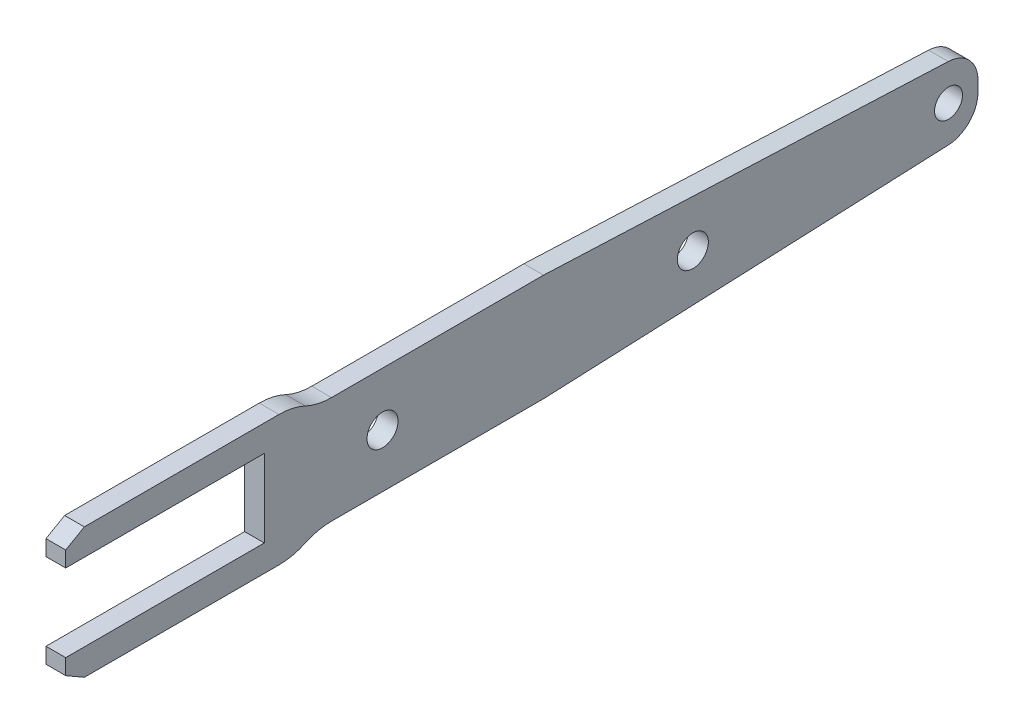
ISO-10303-21;
HEADER;
FILE_DESCRIPTION(('STEP AP214'),'2;1');
FILE_NAME('part.step','',(''),(''),'','','');
FILE_SCHEMA(('AUTOMOTIVE_DESIGN { 1 0 10303 214 1 1 1 1 }'));
ENDSEC;
DATA;
#1=APPLICATION_CONTEXT('core data for automotive mechanical design processes');
#2=APPLICATION_PROTOCOL_DEFINITION('international standard','automotive_design',2000,#1);
#3=PRODUCT_CONTEXT('',#1,'mechanical');
#4=PRODUCT('Part','Part','',(#3));
#5=PRODUCT_RELATED_PRODUCT_CATEGORY('part','',(#4));
#6=PRODUCT_DEFINITION_FORMATION('','',#4);
#7=PRODUCT_DEFINITION_CONTEXT('part definition',#1,'design');
#8=PRODUCT_DEFINITION('design','',#6,#7);
#9=PRODUCT_DEFINITION_SHAPE('','',#8);
#10=(LENGTH_UNIT() NAMED_UNIT(*) SI_UNIT(.MILLI.,.METRE.));
#11=(NAMED_UNIT(*) PLANE_ANGLE_UNIT() SI_UNIT($,.RADIAN.));
#12=(NAMED_UNIT(*) SI_UNIT($,.STERADIAN.) SOLID_ANGLE_UNIT());
#13=UNCERTAINTY_MEASURE_WITH_UNIT(LENGTH_MEASURE(1.E-05),#10,'distance_accuracy_value','');
#14=(GEOMETRIC_REPRESENTATION_CONTEXT(3) GLOBAL_UNCERTAINTY_ASSIGNED_CONTEXT((#13)) GLOBAL_UNIT_ASSIGNED_CONTEXT((#10,
#11,#12)) REPRESENTATION_CONTEXT('',''));
#15=CARTESIAN_POINT('',(0.,0.,0.));
#16=DIRECTION('',(0.,0.,1.));
#17=DIRECTION('',(1.,0.,0.));
#18=AXIS2_PLACEMENT_3D('',#15,#16,#17);
#19=CARTESIAN_POINT('',(-6.57499999999999,-6.25,-32.));
#20=DIRECTION('',(0.,-1.,0.));
#21=DIRECTION('',(0.,0.,-1.));
#22=AXIS2_PLACEMENT_3D('',#19,#20,#21);
#23=PLANE('',#22);
#24=DIRECTION('',(0.,0.,1.));
#25=VECTOR('',#24,1.);
#26=CARTESIAN_POINT('',(-9.74999999999999,-6.25,-32.));
#27=LINE('',#26,#25);
#28=CARTESIAN_POINT('',(-9.74999999999999,-6.25,-32.));
#29=VERTEX_POINT('',#28);
#30=CARTESIAN_POINT('',(-9.74999999999999,-6.25,0.));
#31=VERTEX_POINT('',#30);
#32=EDGE_CURVE('E203',#29,#31,#27,.T.);
#33=ORIENTED_EDGE('',*,*,#32,.T.);
#34=DIRECTION('',(-1.,0.,0.));
#35=VECTOR('',#34,1.);
#36=CARTESIAN_POINT('',(-6.57499999999999,-6.25,0.));
#37=LINE('',#36,#35);
#38=CARTESIAN_POINT('',(-6.57499999999999,-6.25,0.));
#39=VERTEX_POINT('',#38);
#40=EDGE_CURVE('E185',#39,#31,#37,.T.);
#41=ORIENTED_EDGE('',*,*,#40,.F.);
#42=DIRECTION('',(0.,0.,1.));
#43=VECTOR('',#42,1.);
#44=CARTESIAN_POINT('',(-6.57499999999999,-6.25,-32.));
#45=LINE('',#44,#43);
#46=CARTESIAN_POINT('',(-6.57499999999999,-6.25,-32.));
#47=VERTEX_POINT('',#46);
#48=EDGE_CURVE('E191',#47,#39,#45,.T.);
#49=ORIENTED_EDGE('',*,*,#48,.F.);
#50=DIRECTION('',(-1.,0.,0.));
#51=VECTOR('',#50,1.);
#52=CARTESIAN_POINT('',(-6.57499999999999,-6.25,-32.));
#53=LINE('',#52,#51);
#54=EDGE_CURVE('E282',#47,#29,#53,.T.);
#55=ORIENTED_EDGE('',*,*,#54,.T.);
#56=EDGE_LOOP('',(#33,#41,#49,#55));
#57=FACE_BOUND('',#56,.T.);
#58=ADVANCED_FACE('F41',(#57),#23,.F.);
#59=CARTESIAN_POINT('',(-6.57499999999999,-6.25,0.));
#60=DIRECTION('',(0.,0.,-1.));
#61=DIRECTION('',(-1.,0.,0.));
#62=AXIS2_PLACEMENT_3D('',#59,#60,#61);
#63=PLANE('',#62);
#64=DIRECTION('',(0.,-1.,0.));
#65=VECTOR('',#64,1.);
#66=CARTESIAN_POINT('',(-9.74999999999999,-6.25,0.));
#67=LINE('',#66,#65);
#68=CARTESIAN_POINT('',(-9.74999999999999,-8.76794919243112,0.));
#69=VERTEX_POINT('',#68);
#70=EDGE_CURVE('E284',#31,#69,#67,.T.);
#71=ORIENTED_EDGE('',*,*,#70,.T.);
#72=DIRECTION('',(-1.,0.,0.));
#73=VECTOR('',#72,1.);
#74=CARTESIAN_POINT('',(-6.57499999999999,-8.76794919243112,0.));
#75=LINE('',#74,#73);
#76=CARTESIAN_POINT('',(-6.57499999999999,-8.76794919243112,0.));
#77=VERTEX_POINT('',#76);
#78=EDGE_CURVE('E188',#77,#69,#75,.T.);
#79=ORIENTED_EDGE('',*,*,#78,.F.);
#80=DIRECTION('',(0.,-1.,0.));
#81=VECTOR('',#80,1.);
#82=CARTESIAN_POINT('',(-6.57499999999999,-6.25,0.));
#83=LINE('',#82,#81);
#84=EDGE_CURVE('E181',#39,#77,#83,.T.);
#85=ORIENTED_EDGE('',*,*,#84,.F.);
#86=ORIENTED_EDGE('',*,*,#40,.T.);
#87=EDGE_LOOP('',(#71,#79,#85,#86));
#88=FACE_BOUND('',#87,.T.);
#89=ADVANCED_FACE('F183',(#88),#63,.F.);
#90=CARTESIAN_POINT('',(-6.57499999999999,-8.76794919243112,0.));
#91=DIRECTION('',(0.,0.86602540378444,-0.499999999999997));
#92=DIRECTION('',(0.,0.499999999999998,0.86602540378444));
#93=AXIS2_PLACEMENT_3D('',#90,#91,#92);
#94=PLANE('',#93);
#95=DIRECTION('',(0.,-0.499999999999997,-0.86602540378444));
#96=VECTOR('',#95,1.);
#97=CARTESIAN_POINT('',(-9.74999999999999,-8.76794919243112,0.));
#98=LINE('',#97,#96);
#99=CARTESIAN_POINT('',(-9.74999999999999,-10.5,-3.00000000000002));
#100=VERTEX_POINT('',#99);
#101=EDGE_CURVE('E286',#69,#100,#98,.T.);
#102=ORIENTED_EDGE('',*,*,#101,.T.);
#103=DIRECTION('',(-1.,0.,0.));
#104=VECTOR('',#103,1.);
#105=CARTESIAN_POINT('',(-6.57499999999999,-10.5,-3.00000000000002));
#106=LINE('',#105,#104);
#107=CARTESIAN_POINT('',(-6.57499999999999,-10.5,-3.00000000000002));
#108=VERTEX_POINT('',#107);
#109=EDGE_CURVE('E209',#108,#100,#106,.T.);
#110=ORIENTED_EDGE('',*,*,#109,.F.);
#111=DIRECTION('',(0.,-0.499999999999997,-0.86602540378444));
#112=VECTOR('',#111,1.);
#113=CARTESIAN_POINT('',(-6.57499999999999,-8.76794919243112,0.));
#114=LINE('',#113,#112);
#115=EDGE_CURVE('E190',#77,#108,#114,.T.);
#116=ORIENTED_EDGE('',*,*,#115,.F.);
#117=ORIENTED_EDGE('',*,*,#78,.T.);
#118=EDGE_LOOP('',(#102,#110,#116,#117));
#119=FACE_BOUND('',#118,.T.);
#120=ADVANCED_FACE('F369',(#119),#94,.F.);
#121=CARTESIAN_POINT('',(-6.57499999999999,-10.5,-3.00000000000002));
#122=DIRECTION('',(0.,1.,0.));
#123=DIRECTION('',(0.,0.,1.));
#124=AXIS2_PLACEMENT_3D('',#121,#122,#123);
#125=PLANE('',#124);
#126=DIRECTION('',(0.,0.,-1.));
#127=VECTOR('',#126,1.);
#128=CARTESIAN_POINT('',(-9.74999999999999,-10.5,-3.00000000000002));
#129=LINE('',#128,#127);
#130=CARTESIAN_POINT('',(-9.74999999999999,-10.5,-34.3747686216376));
#131=VERTEX_POINT('',#130);
#132=EDGE_CURVE('E288',#100,#131,#129,.T.);
#133=ORIENTED_EDGE('',*,*,#132,.T.);
#134=DIRECTION('',(-1.,0.,0.));
#135=VECTOR('',#134,1.);
#136=CARTESIAN_POINT('',(-6.57499999999999,-10.5,-34.3747686216376));
#137=LINE('',#136,#135);
#138=CARTESIAN_POINT('',(-6.57499999999999,-10.5,-34.3747686216376));
#139=VERTEX_POINT('',#138);
#140=EDGE_CURVE('E343',#139,#131,#137,.T.);
#141=ORIENTED_EDGE('',*,*,#140,.F.);
#142=DIRECTION('',(0.,0.,-1.));
#143=VECTOR('',#142,1.);
#144=CARTESIAN_POINT('',(-6.57499999999999,-10.5,-3.00000000000002));
#145=LINE('',#144,#143);
#146=EDGE_CURVE('E256',#108,#139,#145,.T.);
#147=ORIENTED_EDGE('',*,*,#146,.F.);
#148=ORIENTED_EDGE('',*,*,#109,.T.);
#149=EDGE_LOOP('',(#133,#141,#147,#148));
#150=FACE_BOUND('',#149,.T.);
#151=ADVANCED_FACE('F350',(#150),#125,.F.);
#152=CARTESIAN_POINT('',(-6.57499999999999,-0.5,-34.3747686216376));
#153=DIRECTION('',(-1.,0.,0.));
#154=DIRECTION('',(0.,0.,1.));
#155=AXIS2_PLACEMENT_3D('',#152,#153,#154);
#156=CYLINDRICAL_SURFACE('',#155,9.99999999999999);
#157=CARTESIAN_POINT('',(-9.74999999999999,-0.5,-34.3747686216376));
#158=DIRECTION('',(1.,0.,0.));
#159=DIRECTION('',(0.,0.,-1.));
#160=AXIS2_PLACEMENT_3D('',#157,#158,#159);
#161=CIRCLE('',#160,9.99999999999999);
#162=CARTESIAN_POINT('',(-9.74999999999999,-9.5625,-38.602190264909));
#163=VERTEX_POINT('',#162);
#164=EDGE_CURVE('E290',#131,#163,#161,.T.);
#165=ORIENTED_EDGE('',*,*,#164,.T.);
#166=DIRECTION('',(-1.,0.,0.));
#167=VECTOR('',#166,1.);
#168=CARTESIAN_POINT('',(-6.57499999999999,-9.5625,-38.602190264909));
#169=LINE('',#168,#167);
#170=CARTESIAN_POINT('',(-6.57499999999999,-9.5625,-38.602190264909));
#171=VERTEX_POINT('',#170);
#172=EDGE_CURVE('E340',#171,#163,#169,.T.);
#173=ORIENTED_EDGE('',*,*,#172,.F.);
#174=CARTESIAN_POINT('',(-6.57499999999999,-0.5,-34.3747686216376));
#175=DIRECTION('',(1.,0.,0.));
#176=DIRECTION('',(0.,0.,-1.));
#177=AXIS2_PLACEMENT_3D('',#174,#175,#176);
#178=CIRCLE('',#177,9.99999999999999);
#179=EDGE_CURVE('E258',#139,#171,#178,.T.);
#180=ORIENTED_EDGE('',*,*,#179,.F.);
#181=ORIENTED_EDGE('',*,*,#140,.T.);
#182=EDGE_LOOP('',(#165,#173,#180,#181));
#183=FACE_BOUND('',#182,.T.);
#184=ADVANCED_FACE('F362',(#183),#156,.T.);
#185=CARTESIAN_POINT('',(-6.57499999999999,-18.625,-42.8296119081805));
#186=DIRECTION('',(-1.,0.,0.));
#187=DIRECTION('',(0.,0.,1.));
#188=AXIS2_PLACEMENT_3D('',#185,#186,#187);
#189=CYLINDRICAL_SURFACE('',#188,10.);
#190=CARTESIAN_POINT('',(-9.74999999999999,-18.625,-42.8296119081805));
#191=DIRECTION('',(-1.,0.,0.));
#192=DIRECTION('',(0.,0.,-1.));
#193=AXIS2_PLACEMENT_3D('',#190,#191,#192);
#194=CIRCLE('',#193,10.);
#195=CARTESIAN_POINT('',(-9.74999999999999,-8.62499999999999,-42.8296119081805));
#196=VERTEX_POINT('',#195);
#197=EDGE_CURVE('E292',#163,#196,#194,.T.);
#198=ORIENTED_EDGE('',*,*,#197,.T.);
#199=DIRECTION('',(-1.,0.,0.));
#200=VECTOR('',#199,1.);
#201=CARTESIAN_POINT('',(-6.57499999999999,-8.62499999999999,-42.8296119081805));
#202=LINE('',#201,#200);
#203=CARTESIAN_POINT('',(-6.57499999999999,-8.62499999999999,-42.8296119081805));
#204=VERTEX_POINT('',#203);
#205=EDGE_CURVE('E337',#204,#196,#202,.T.);
#206=ORIENTED_EDGE('',*,*,#205,.F.);
#207=CARTESIAN_POINT('',(-6.57499999999999,-18.625,-42.8296119081805));
#208=DIRECTION('',(-1.,0.,0.));
#209=DIRECTION('',(0.,0.,-1.));
#210=AXIS2_PLACEMENT_3D('',#207,#208,#209);
#211=CIRCLE('',#210,10.);
#212=EDGE_CURVE('E260',#171,#204,#211,.T.);
#213=ORIENTED_EDGE('',*,*,#212,.F.);
#214=ORIENTED_EDGE('',*,*,#172,.T.);
#215=EDGE_LOOP('',(#198,#206,#213,#214));
#216=FACE_BOUND('',#215,.T.);
#217=ADVANCED_FACE('F366',(#216),#189,.F.);
#218=CARTESIAN_POINT('',(-6.57499999999999,-8.62499999999999,-42.8296119081805));
#219=DIRECTION('',(0.,1.,0.));
#220=DIRECTION('',(0.,0.,1.));
#221=AXIS2_PLACEMENT_3D('',#218,#219,#220);
#222=PLANE('',#221);
#223=DIRECTION('',(0.,0.,-1.));
#224=VECTOR('',#223,1.);
#225=CARTESIAN_POINT('',(-9.74999999999999,-8.62499999999999,-42.8296119081805));
#226=LINE('',#225,#224);
#227=CARTESIAN_POINT('',(-9.74999999999999,-8.62499999999999,-77.));
#228=VERTEX_POINT('',#227);
#229=EDGE_CURVE('E294',#196,#228,#226,.T.);
#230=ORIENTED_EDGE('',*,*,#229,.T.);
#231=DIRECTION('',(1.,0.,0.));
#232=VECTOR('',#231,1.);
#233=CARTESIAN_POINT('',(-6.57499999999999,-8.62499999999999,-77.));
#234=LINE('',#233,#232);
#235=CARTESIAN_POINT('',(-6.57499999999999,-8.62499999999999,-77.));
#236=VERTEX_POINT('',#235);
#237=EDGE_CURVE('E214',#228,#236,#234,.T.);
#238=ORIENTED_EDGE('',*,*,#237,.T.);
#239=DIRECTION('',(0.,0.,-1.));
#240=VECTOR('',#239,1.);
#241=CARTESIAN_POINT('',(-6.57499999999999,-8.62499999999999,-42.8296119081805));
#242=LINE('',#241,#240);
#243=EDGE_CURVE('E262',#204,#236,#242,.T.);
#244=ORIENTED_EDGE('',*,*,#243,.F.);
#245=ORIENTED_EDGE('',*,*,#205,.T.);
#246=EDGE_LOOP('',(#230,#238,#244,#245));
#247=FACE_BOUND('',#246,.T.);
#248=ADVANCED_FACE('F479',(#247),#222,.F.);
#249=CARTESIAN_POINT('',(-6.57499999999999,-8.625,-147.));
#250=DIRECTION('',(0.,0.,1.));
#251=DIRECTION('',(1.,0.,0.));
#252=AXIS2_PLACEMENT_3D('',#249,#250,#251);
#253=PLANE('',#252);
#254=DIRECTION('',(0.,1.,0.));
#255=VECTOR('',#254,1.);
#256=CARTESIAN_POINT('',(-6.57499999999999,-8.625,-147.));
#257=LINE('',#256,#255);
#258=CARTESIAN_POINT('',(-6.57499999999999,-0.834695984112875,-147.));
#259=VERTEX_POINT('',#258);
#260=CARTESIAN_POINT('',(-6.57499999999999,0.83469598411331,-147.));
#261=VERTEX_POINT('',#260);
#262=EDGE_CURVE('E265',#259,#261,#257,.T.);
#263=ORIENTED_EDGE('',*,*,#262,.F.);
#264=DIRECTION('',(1.,0.,0.));
#265=VECTOR('',#264,1.);
#266=CARTESIAN_POINT('',(-9.74999999999999,-0.834695984112875,-147.));
#267=LINE('',#266,#265);
#268=CARTESIAN_POINT('',(-9.74999999999999,-0.834695984112875,-147.));
#269=VERTEX_POINT('',#268);
#270=EDGE_CURVE('E226',#259,#269,#267,.F.);
#271=ORIENTED_EDGE('',*,*,#270,.T.);
#272=DIRECTION('',(0.,1.,0.));
#273=VECTOR('',#272,1.);
#274=CARTESIAN_POINT('',(-9.74999999999999,-8.625,-147.));
#275=LINE('',#274,#273);
#276=CARTESIAN_POINT('',(-9.74999999999999,0.83469598411331,-147.));
#277=VERTEX_POINT('',#276);
#278=EDGE_CURVE('E297',#269,#277,#275,.T.);
#279=ORIENTED_EDGE('',*,*,#278,.T.);
#280=DIRECTION('',(-1.,0.,0.));
#281=VECTOR('',#280,1.);
#282=CARTESIAN_POINT('',(-6.57499999999999,0.83469598411331,-147.));
#283=LINE('',#282,#281);
#284=EDGE_CURVE('E223',#277,#261,#283,.F.);
#285=ORIENTED_EDGE('',*,*,#284,.T.);
#286=EDGE_LOOP('',(#263,#271,#279,#285));
#287=FACE_BOUND('',#286,.T.);
#288=ADVANCED_FACE('F410',(#287),#253,.F.);
#289=CARTESIAN_POINT('',(-6.57499999999999,8.625,-147.));
#290=DIRECTION('',(0.,-1.,0.));
#291=DIRECTION('',(0.,0.,-1.));
#292=AXIS2_PLACEMENT_3D('',#289,#290,#291);
#293=PLANE('',#292);
#294=DIRECTION('',(0.,0.,1.));
#295=VECTOR('',#294,1.);
#296=CARTESIAN_POINT('',(-6.57499999999999,8.625,-147.));
#297=LINE('',#296,#295);
#298=CARTESIAN_POINT('',(-6.57499999999999,8.625,-76.9999999999943));
#299=VERTEX_POINT('',#298);
#300=CARTESIAN_POINT('',(-6.57499999999999,8.625,-42.8296119081805));
#301=VERTEX_POINT('',#300);
#302=EDGE_CURVE('E267',#299,#301,#297,.T.);
#303=ORIENTED_EDGE('',*,*,#302,.F.);
#304=DIRECTION('',(-1.,0.,0.));
#305=VECTOR('',#304,1.);
#306=CARTESIAN_POINT('',(-6.57499999999999,8.625,-76.9999999999943));
#307=LINE('',#306,#305);
#308=CARTESIAN_POINT('',(-9.74999999999999,8.625,-76.9999999999943));
#309=VERTEX_POINT('',#308);
#310=EDGE_CURVE('E220',#299,#309,#307,.T.);
#311=ORIENTED_EDGE('',*,*,#310,.T.);
#312=DIRECTION('',(0.,0.,1.));
#313=VECTOR('',#312,1.);
#314=CARTESIAN_POINT('',(-9.74999999999999,8.625,-147.));
#315=LINE('',#314,#313);
#316=CARTESIAN_POINT('',(-9.74999999999999,8.625,-42.8296119081805));
#317=VERTEX_POINT('',#316);
#318=EDGE_CURVE('E300',#309,#317,#315,.T.);
#319=ORIENTED_EDGE('',*,*,#318,.T.);
#320=DIRECTION('',(-1.,0.,0.));
#321=VECTOR('',#320,1.);
#322=CARTESIAN_POINT('',(-6.57499999999999,8.625,-42.8296119081805));
#323=LINE('',#322,#321);
#324=EDGE_CURVE('E334',#301,#317,#323,.T.);
#325=ORIENTED_EDGE('',*,*,#324,.F.);
#326=EDGE_LOOP('',(#303,#311,#319,#325));
#327=FACE_BOUND('',#326,.T.);
#328=ADVANCED_FACE('F421',(#327),#293,.F.);
#329=CARTESIAN_POINT('',(-6.57499999999999,18.625,-42.8296119081805));
#330=DIRECTION('',(-1.,0.,0.));
#331=DIRECTION('',(0.,0.,1.));
#332=AXIS2_PLACEMENT_3D('',#329,#330,#331);
#333=CYLINDRICAL_SURFACE('',#332,10.);
#334=CARTESIAN_POINT('',(-9.74999999999999,18.625,-42.8296119081805));
#335=DIRECTION('',(-1.,0.,0.));
#336=DIRECTION('',(0.,0.,-1.));
#337=AXIS2_PLACEMENT_3D('',#334,#335,#336);
#338=CIRCLE('',#337,10.);
#339=CARTESIAN_POINT('',(-9.74999999999999,9.5625,-38.602190264909));
#340=VERTEX_POINT('',#339);
#341=EDGE_CURVE('E302',#317,#340,#338,.T.);
#342=ORIENTED_EDGE('',*,*,#341,.T.);
#343=DIRECTION('',(-1.,0.,0.));
#344=VECTOR('',#343,1.);
#345=CARTESIAN_POINT('',(-6.57499999999999,9.5625,-38.602190264909));
#346=LINE('',#345,#344);
#347=CARTESIAN_POINT('',(-6.57499999999999,9.5625,-38.602190264909));
#348=VERTEX_POINT('',#347);
#349=EDGE_CURVE('E331',#348,#340,#346,.T.);
#350=ORIENTED_EDGE('',*,*,#349,.F.);
#351=CARTESIAN_POINT('',(-6.57499999999999,18.625,-42.8296119081805));
#352=DIRECTION('',(-1.,0.,0.));
#353=DIRECTION('',(0.,0.,-1.));
#354=AXIS2_PLACEMENT_3D('',#351,#352,#353);
#355=CIRCLE('',#354,10.);
#356=EDGE_CURVE('E269',#301,#348,#355,.T.);
#357=ORIENTED_EDGE('',*,*,#356,.F.);
#358=ORIENTED_EDGE('',*,*,#324,.T.);
#359=EDGE_LOOP('',(#342,#350,#357,#358));
#360=FACE_BOUND('',#359,.T.);
#361=ADVANCED_FACE('F424',(#360),#333,.F.);
#362=CARTESIAN_POINT('',(-6.57499999999999,0.5,-34.3747686216376));
#363=DIRECTION('',(-1.,0.,0.));
#364=DIRECTION('',(0.,0.,1.));
#365=AXIS2_PLACEMENT_3D('',#362,#363,#364);
#366=CYLINDRICAL_SURFACE('',#365,10.);
#367=CARTESIAN_POINT('',(-9.74999999999999,0.5,-34.3747686216376));
#368=DIRECTION('',(1.,0.,0.));
#369=DIRECTION('',(0.,0.,-1.));
#370=AXIS2_PLACEMENT_3D('',#367,#368,#369);
#371=CIRCLE('',#370,10.);
#372=CARTESIAN_POINT('',(-9.74999999999999,10.5,-34.3747686216376));
#373=VERTEX_POINT('',#372);
#374=EDGE_CURVE('E304',#340,#373,#371,.T.);
#375=ORIENTED_EDGE('',*,*,#374,.T.);
#376=DIRECTION('',(-1.,0.,0.));
#377=VECTOR('',#376,1.);
#378=CARTESIAN_POINT('',(-6.57499999999999,10.5,-34.3747686216376));
#379=LINE('',#378,#377);
#380=CARTESIAN_POINT('',(-6.57499999999999,10.5,-34.3747686216376));
#381=VERTEX_POINT('',#380);
#382=EDGE_CURVE('E328',#381,#373,#379,.T.);
#383=ORIENTED_EDGE('',*,*,#382,.F.);
#384=CARTESIAN_POINT('',(-6.57499999999999,0.5,-34.3747686216376));
#385=DIRECTION('',(1.,0.,0.));
#386=DIRECTION('',(0.,0.,-1.));
#387=AXIS2_PLACEMENT_3D('',#384,#385,#386);
#388=CIRCLE('',#387,10.);
#389=EDGE_CURVE('E271',#348,#381,#388,.T.);
#390=ORIENTED_EDGE('',*,*,#389,.F.);
#391=ORIENTED_EDGE('',*,*,#349,.T.);
#392=EDGE_LOOP('',(#375,#383,#390,#391));
#393=FACE_BOUND('',#392,.T.);
#394=ADVANCED_FACE('F431',(#393),#366,.T.);
#395=CARTESIAN_POINT('',(-6.57499999999999,10.5,-34.3747686216376));
#396=DIRECTION('',(0.,-1.,0.));
#397=DIRECTION('',(0.,0.,-1.));
#398=AXIS2_PLACEMENT_3D('',#395,#396,#397);
#399=PLANE('',#398);
#400=DIRECTION('',(0.,0.,1.));
#401=VECTOR('',#400,1.);
#402=CARTESIAN_POINT('',(-9.74999999999999,10.5,-34.3747686216376));
#403=LINE('',#402,#401);
#404=CARTESIAN_POINT('',(-9.74999999999999,10.5,-3.00000000000003));
#405=VERTEX_POINT('',#404);
#406=EDGE_CURVE('E306',#373,#405,#403,.T.);
#407=ORIENTED_EDGE('',*,*,#406,.T.);
#408=DIRECTION('',(-1.,0.,0.));
#409=VECTOR('',#408,1.);
#410=CARTESIAN_POINT('',(-6.57499999999999,10.5,-3.00000000000003));
#411=LINE('',#410,#409);
#412=CARTESIAN_POINT('',(-6.57499999999999,10.5,-3.00000000000003));
#413=VERTEX_POINT('',#412);
#414=EDGE_CURVE('E325',#413,#405,#411,.T.);
#415=ORIENTED_EDGE('',*,*,#414,.F.);
#416=DIRECTION('',(0.,0.,1.));
#417=VECTOR('',#416,1.);
#418=CARTESIAN_POINT('',(-6.57499999999999,10.5,-34.3747686216376));
#419=LINE('',#418,#417);
#420=EDGE_CURVE('E273',#381,#413,#419,.T.);
#421=ORIENTED_EDGE('',*,*,#420,.F.);
#422=ORIENTED_EDGE('',*,*,#382,.T.);
#423=EDGE_LOOP('',(#407,#415,#421,#422));
#424=FACE_BOUND('',#423,.T.);
#425=ADVANCED_FACE('F434',(#424),#399,.F.);
#426=CARTESIAN_POINT('',(-6.57499999999999,10.5,-3.00000000000003));
#427=DIRECTION('',(0.,-0.866025403784439,-0.5));
#428=DIRECTION('',(0.,0.5,-0.866025403784439));
#429=AXIS2_PLACEMENT_3D('',#426,#427,#428);
#430=PLANE('',#429);
#431=DIRECTION('',(0.,-0.5,0.866025403784439));
#432=VECTOR('',#431,1.);
#433=CARTESIAN_POINT('',(-9.74999999999999,10.5,-3.00000000000003));
#434=LINE('',#433,#432);
#435=CARTESIAN_POINT('',(-9.74999999999999,8.76794919243111,0.));
#436=VERTEX_POINT('',#435);
#437=EDGE_CURVE('E308',#405,#436,#434,.T.);
#438=ORIENTED_EDGE('',*,*,#437,.T.);
#439=DIRECTION('',(-1.,0.,0.));
#440=VECTOR('',#439,1.);
#441=CARTESIAN_POINT('',(-6.57499999999999,8.76794919243111,0.));
#442=LINE('',#441,#440);
#443=CARTESIAN_POINT('',(-6.57499999999999,8.76794919243111,0.));
#444=VERTEX_POINT('',#443);
#445=EDGE_CURVE('E322',#444,#436,#442,.T.);
#446=ORIENTED_EDGE('',*,*,#445,.F.);
#447=DIRECTION('',(0.,-0.5,0.866025403784439));
#448=VECTOR('',#447,1.);
#449=CARTESIAN_POINT('',(-6.57499999999999,10.5,-3.00000000000003));
#450=LINE('',#449,#448);
#451=EDGE_CURVE('E275',#413,#444,#450,.T.);
#452=ORIENTED_EDGE('',*,*,#451,.F.);
#453=ORIENTED_EDGE('',*,*,#414,.T.);
#454=EDGE_LOOP('',(#438,#446,#452,#453));
#455=FACE_BOUND('',#454,.T.);
#456=ADVANCED_FACE('F439',(#455),#430,.F.);
#457=CARTESIAN_POINT('',(-6.57499999999999,8.76794919243111,0.));
#458=DIRECTION('',(0.,0.,-1.));
#459=DIRECTION('',(-1.,0.,0.));
#460=AXIS2_PLACEMENT_3D('',#457,#458,#459);
#461=PLANE('',#460);
#462=DIRECTION('',(0.,-1.,0.));
#463=VECTOR('',#462,1.);
#464=CARTESIAN_POINT('',(-9.74999999999999,8.76794919243111,0.));
#465=LINE('',#464,#463);
#466=CARTESIAN_POINT('',(-9.74999999999999,6.25,0.));
#467=VERTEX_POINT('',#466);
#468=EDGE_CURVE('E310',#436,#467,#465,.T.);
#469=ORIENTED_EDGE('',*,*,#468,.T.);
#470=DIRECTION('',(-1.,0.,0.));
#471=VECTOR('',#470,1.);
#472=CARTESIAN_POINT('',(-6.57499999999999,6.25,0.));
#473=LINE('',#472,#471);
#474=CARTESIAN_POINT('',(-6.57499999999999,6.25,0.));
#475=VERTEX_POINT('',#474);
#476=EDGE_CURVE('E319',#475,#467,#473,.T.);
#477=ORIENTED_EDGE('',*,*,#476,.F.);
#478=DIRECTION('',(0.,-1.,0.));
#479=VECTOR('',#478,1.);
#480=CARTESIAN_POINT('',(-6.57499999999999,8.76794919243111,0.));
#481=LINE('',#480,#479);
#482=EDGE_CURVE('E277',#444,#475,#481,.T.);
#483=ORIENTED_EDGE('',*,*,#482,.F.);
#484=ORIENTED_EDGE('',*,*,#445,.T.);
#485=EDGE_LOOP('',(#469,#477,#483,#484));
#486=FACE_BOUND('',#485,.T.);
#487=ADVANCED_FACE('F445',(#486),#461,.F.);
#488=CARTESIAN_POINT('',(-6.57499999999999,6.25,0.));
#489=DIRECTION('',(0.,1.,0.));
#490=DIRECTION('',(0.,0.,1.));
#491=AXIS2_PLACEMENT_3D('',#488,#489,#490);
#492=PLANE('',#491);
#493=DIRECTION('',(0.,0.,-1.));
#494=VECTOR('',#493,1.);
#495=CARTESIAN_POINT('',(-9.74999999999999,6.25,0.));
#496=LINE('',#495,#494);
#497=CARTESIAN_POINT('',(-9.74999999999999,6.25,-32.));
#498=VERTEX_POINT('',#497);
#499=EDGE_CURVE('E312',#467,#498,#496,.T.);
#500=ORIENTED_EDGE('',*,*,#499,.T.);
#501=DIRECTION('',(-1.,0.,0.));
#502=VECTOR('',#501,1.);
#503=CARTESIAN_POINT('',(-6.57499999999999,6.25,-32.));
#504=LINE('',#503,#502);
#505=CARTESIAN_POINT('',(-6.57499999999999,6.25,-32.));
#506=VERTEX_POINT('',#505);
#507=EDGE_CURVE('E316',#506,#498,#504,.T.);
#508=ORIENTED_EDGE('',*,*,#507,.F.);
#509=DIRECTION('',(0.,0.,-1.));
#510=VECTOR('',#509,1.);
#511=CARTESIAN_POINT('',(-6.57499999999999,6.25,0.));
#512=LINE('',#511,#510);
#513=EDGE_CURVE('E279',#475,#506,#512,.T.);
#514=ORIENTED_EDGE('',*,*,#513,.F.);
#515=ORIENTED_EDGE('',*,*,#476,.T.);
#516=EDGE_LOOP('',(#500,#508,#514,#515));
#517=FACE_BOUND('',#516,.T.);
#518=ADVANCED_FACE('F449',(#517),#492,.F.);
#519=CARTESIAN_POINT('',(-6.57499999999999,6.25,-32.));
#520=DIRECTION('',(0.,0.,-1.));
#521=DIRECTION('',(-1.,0.,0.));
#522=AXIS2_PLACEMENT_3D('',#519,#520,#521);
#523=PLANE('',#522);
#524=DIRECTION('',(0.,-1.,0.));
#525=VECTOR('',#524,1.);
#526=CARTESIAN_POINT('',(-9.74999999999999,6.25,-32.));
#527=LINE('',#526,#525);
#528=EDGE_CURVE('E200',#498,#29,#527,.T.);
#529=ORIENTED_EDGE('',*,*,#528,.T.);
#530=ORIENTED_EDGE('',*,*,#54,.F.);
#531=DIRECTION('',(0.,-1.,0.));
#532=VECTOR('',#531,1.);
#533=CARTESIAN_POINT('',(-6.57499999999999,6.25,-32.));
#534=LINE('',#533,#532);
#535=EDGE_CURVE('E196',#506,#47,#534,.T.);
#536=ORIENTED_EDGE('',*,*,#535,.F.);
#537=ORIENTED_EDGE('',*,*,#507,.T.);
#538=EDGE_LOOP('',(#529,#530,#536,#537));
#539=FACE_BOUND('',#538,.T.);
#540=ADVANCED_FACE('F452',(#539),#523,.F.);
#541=CARTESIAN_POINT('',(-6.57499999999999,-0.5,-34.3747686216376));
#542=DIRECTION('',(1.,0.,0.));
#543=DIRECTION('',(0.,0.,-1.));
#544=AXIS2_PLACEMENT_3D('',#541,#542,#543);
#545=PLANE('',#544);
#546=CARTESIAN_POINT('',(-6.57499999999999,0.,-51.0519334951158));
#547=DIRECTION('',(1.,0.,0.));
#548=DIRECTION('',(0.,0.,-1.));
#549=AXIS2_PLACEMENT_3D('',#546,#547,#548);
#550=CIRCLE('',#549,2.5);
#551=CARTESIAN_POINT('',(-6.57499999999999,0.,-53.5519334951158));
#552=VERTEX_POINT('',#551);
#553=EDGE_CURVE('E239',#552,#552,#550,.T.);
#554=ORIENTED_EDGE('',*,*,#553,.F.);
#555=EDGE_LOOP('',(#554));
#556=FACE_BOUND('',#555,.T.);
#557=CARTESIAN_POINT('',(-6.57499999999999,0.,-101.051933495116));
#558=DIRECTION('',(1.,0.,0.));
#559=DIRECTION('',(0.,0.,-1.));
#560=AXIS2_PLACEMENT_3D('',#557,#558,#559);
#561=CIRCLE('',#560,2.49999999999999);
#562=CARTESIAN_POINT('',(-6.57499999999999,0.,-103.551933495116));
#563=VERTEX_POINT('',#562);
#564=EDGE_CURVE('E242',#563,#563,#561,.T.);
#565=ORIENTED_EDGE('',*,*,#564,.F.);
#566=EDGE_LOOP('',(#565));
#567=FACE_BOUND('',#566,.T.);
#568=CARTESIAN_POINT('',(-6.57499999999999,0.,-142.25));
#569=DIRECTION('',(1.,0.,0.));
#570=DIRECTION('',(0.,0.,-1.));
#571=AXIS2_PLACEMENT_3D('',#568,#569,#570);
#572=CIRCLE('',#571,2.25000000000001);
#573=CARTESIAN_POINT('',(-6.57499999999999,0.,-144.5));
#574=VERTEX_POINT('',#573);
#575=EDGE_CURVE('E238',#574,#574,#572,.T.);
#576=ORIENTED_EDGE('',*,*,#575,.F.);
#577=EDGE_LOOP('',(#576));
#578=FACE_BOUND('',#577,.T.);
#579=DIRECTION('',(0.,-0.0428178383921926,0.99908289581767));
#580=VECTOR('',#579,1.);
#581=CARTESIAN_POINT('',(-6.57499999999999,-10.4335503339697,-34.8004922073792));
#582=LINE('',#581,#580);
#583=CARTESIAN_POINT('',(-6.57499999999999,-5.83011046320122,-142.214089191961));
#584=VERTEX_POINT('',#583);
#585=EDGE_CURVE('E218',#236,#584,#582,.F.);
#586=ORIENTED_EDGE('',*,*,#585,.T.);
#587=CARTESIAN_POINT('',(-6.57499999999999,-0.834695984112875,-142.));
#588=DIRECTION('',(1.,0.,0.));
#589=DIRECTION('',(0.,0.,-1.));
#590=AXIS2_PLACEMENT_3D('',#587,#588,#589);
#591=CIRCLE('',#590,5.);
#592=EDGE_CURVE('E50',#584,#259,#591,.T.);
#593=ORIENTED_EDGE('',*,*,#592,.T.);
#594=ORIENTED_EDGE('',*,*,#262,.T.);
#595=CARTESIAN_POINT('',(-6.57499999999999,0.83469598411331,-142.));
#596=DIRECTION('',(1.,0.,0.));
#597=DIRECTION('',(0.,0.,-1.));
#598=AXIS2_PLACEMENT_3D('',#595,#596,#597);
#599=CIRCLE('',#598,5.);
#600=CARTESIAN_POINT('',(-6.57499999999999,5.83011046320166,-142.214089191961));
#601=VERTEX_POINT('',#600);
#602=EDGE_CURVE('E58',#261,#601,#599,.T.);
#603=ORIENTED_EDGE('',*,*,#602,.T.);
#604=DIRECTION('',(0.,-0.0428178383921824,-0.99908289581767));
#605=VECTOR('',#604,1.);
#606=CARTESIAN_POINT('',(-6.57499999999999,10.4317169666845,-34.8432707773526));
#607=LINE('',#606,#605);
#608=EDGE_CURVE('E216',#601,#299,#607,.F.);
#609=ORIENTED_EDGE('',*,*,#608,.T.);
#610=ORIENTED_EDGE('',*,*,#302,.T.);
#611=ORIENTED_EDGE('',*,*,#356,.T.);
#612=ORIENTED_EDGE('',*,*,#389,.T.);
#613=ORIENTED_EDGE('',*,*,#420,.T.);
#614=ORIENTED_EDGE('',*,*,#451,.T.);
#615=ORIENTED_EDGE('',*,*,#482,.T.);
#616=ORIENTED_EDGE('',*,*,#513,.T.);
#617=ORIENTED_EDGE('',*,*,#535,.T.);
#618=ORIENTED_EDGE('',*,*,#48,.T.);
#619=ORIENTED_EDGE('',*,*,#84,.T.);
#620=ORIENTED_EDGE('',*,*,#115,.T.);
#621=ORIENTED_EDGE('',*,*,#146,.T.);
#622=ORIENTED_EDGE('',*,*,#179,.T.);
#623=ORIENTED_EDGE('',*,*,#212,.T.);
#624=ORIENTED_EDGE('',*,*,#243,.T.);
#625=EDGE_LOOP('',(#586,#593,#594,#603,#609,#610,#611,#612,#613,#614,#615,#616,#617,#618,#619,
#620,#621,#622,#623,#624));
#626=FACE_BOUND('',#625,.T.);
#627=ADVANCED_FACE('F194',(#556,#567,#578,#626),#545,.T.);
#628=CARTESIAN_POINT('',(-9.74999999999999,-0.5,-34.3747686216376));
#629=DIRECTION('',(1.,0.,0.));
#630=DIRECTION('',(0.,0.,-1.));
#631=AXIS2_PLACEMENT_3D('',#628,#629,#630);
#632=PLANE('',#631);
#633=CARTESIAN_POINT('',(-9.74999999999999,0.,-51.0519334951158));
#634=DIRECTION('',(1.,0.,0.));
#635=DIRECTION('',(0.,0.,-1.));
#636=AXIS2_PLACEMENT_3D('',#633,#634,#635);
#637=CIRCLE('',#636,2.5);
#638=CARTESIAN_POINT('',(-9.74999999999999,0.,-53.5519334951158));
#639=VERTEX_POINT('',#638);
#640=EDGE_CURVE('E45',#639,#639,#637,.T.);
#641=ORIENTED_EDGE('',*,*,#640,.T.);
#642=EDGE_LOOP('',(#641));
#643=FACE_BOUND('',#642,.T.);
#644=CARTESIAN_POINT('',(-9.74999999999999,0.,-101.051933495116));
#645=DIRECTION('',(1.,0.,0.));
#646=DIRECTION('',(0.,0.,-1.));
#647=AXIS2_PLACEMENT_3D('',#644,#645,#646);
#648=CIRCLE('',#647,2.49999999999999);
#649=CARTESIAN_POINT('',(-9.74999999999999,0.,-103.551933495116));
#650=VERTEX_POINT('',#649);
#651=EDGE_CURVE('E240',#650,#650,#648,.T.);
#652=ORIENTED_EDGE('',*,*,#651,.T.);
#653=EDGE_LOOP('',(#652));
#654=FACE_BOUND('',#653,.T.);
#655=CARTESIAN_POINT('',(-9.74999999999999,0.,-142.25));
#656=DIRECTION('',(1.,0.,0.));
#657=DIRECTION('',(0.,0.,-1.));
#658=AXIS2_PLACEMENT_3D('',#655,#656,#657);
#659=CIRCLE('',#658,2.25000000000001);
#660=CARTESIAN_POINT('',(-9.74999999999999,0.,-144.5));
#661=VERTEX_POINT('',#660);
#662=EDGE_CURVE('E236',#661,#661,#659,.T.);
#663=ORIENTED_EDGE('',*,*,#662,.T.);
#664=EDGE_LOOP('',(#663));
#665=FACE_BOUND('',#664,.T.);
#666=ORIENTED_EDGE('',*,*,#278,.F.);
#667=CARTESIAN_POINT('',(-9.74999999999999,-0.834695984112875,-142.));
#668=DIRECTION('',(1.,0.,0.));
#669=DIRECTION('',(0.,0.,-1.));
#670=AXIS2_PLACEMENT_3D('',#667,#668,#669);
#671=CIRCLE('',#670,5.);
#672=CARTESIAN_POINT('',(-9.74999999999999,-5.83011046320122,-142.214089191961));
#673=VERTEX_POINT('',#672);
#674=EDGE_CURVE('E231',#269,#673,#671,.F.);
#675=ORIENTED_EDGE('',*,*,#674,.T.);
#676=DIRECTION('',(0.,0.0428178383921926,-0.99908289581767));
#677=VECTOR('',#676,1.);
#678=CARTESIAN_POINT('',(-9.74999999999999,-5.62499999999952,-147.));
#679=LINE('',#678,#677);
#680=EDGE_CURVE('E207',#673,#228,#679,.F.);
#681=ORIENTED_EDGE('',*,*,#680,.T.);
#682=ORIENTED_EDGE('',*,*,#229,.F.);
#683=ORIENTED_EDGE('',*,*,#197,.F.);
#684=ORIENTED_EDGE('',*,*,#164,.F.);
#685=ORIENTED_EDGE('',*,*,#132,.F.);
#686=ORIENTED_EDGE('',*,*,#101,.F.);
#687=ORIENTED_EDGE('',*,*,#70,.F.);
#688=ORIENTED_EDGE('',*,*,#32,.F.);
#689=ORIENTED_EDGE('',*,*,#528,.F.);
#690=ORIENTED_EDGE('',*,*,#499,.F.);
#691=ORIENTED_EDGE('',*,*,#468,.F.);
#692=ORIENTED_EDGE('',*,*,#437,.F.);
#693=ORIENTED_EDGE('',*,*,#406,.F.);
#694=ORIENTED_EDGE('',*,*,#374,.F.);
#695=ORIENTED_EDGE('',*,*,#341,.F.);
#696=ORIENTED_EDGE('',*,*,#318,.F.);
#697=DIRECTION('',(0.,0.0428178383921824,0.99908289581767));
#698=VECTOR('',#697,1.);
#699=CARTESIAN_POINT('',(-9.74999999999999,8.625,-76.9999999999943));
#700=LINE('',#699,#698);
#701=CARTESIAN_POINT('',(-9.74999999999999,5.83011046320166,-142.214089191961));
#702=VERTEX_POINT('',#701);
#703=EDGE_CURVE('E204',#309,#702,#700,.F.);
#704=ORIENTED_EDGE('',*,*,#703,.T.);
#705=CARTESIAN_POINT('',(-9.74999999999999,0.83469598411331,-142.));
#706=DIRECTION('',(1.,0.,0.));
#707=DIRECTION('',(0.,0.,-1.));
#708=AXIS2_PLACEMENT_3D('',#705,#706,#707);
#709=CIRCLE('',#708,5.);
#710=EDGE_CURVE('E229',#702,#277,#709,.F.);
#711=ORIENTED_EDGE('',*,*,#710,.T.);
#712=EDGE_LOOP('',(#666,#675,#681,#682,#683,#684,#685,#686,#687,#688,#689,#690,#691,#692,#693,
#694,#695,#696,#704,#711));
#713=FACE_BOUND('',#712,.T.);
#714=ADVANCED_FACE('F357',(#643,#654,#665,#713),#632,.F.);
#715=CARTESIAN_POINT('',(-6.57499999999999,-5.62499999999952,-147.));
#716=DIRECTION('',(0.,0.999082895817669,0.0428178383921926));
#717=DIRECTION('',(-1.,0.,0.));
#718=AXIS2_PLACEMENT_3D('',#715,#716,#717);
#719=PLANE('',#718);
#720=ORIENTED_EDGE('',*,*,#680,.F.);
#721=DIRECTION('',(-1.,0.,0.));
#722=VECTOR('',#721,1.);
#723=CARTESIAN_POINT('',(-6.57499999999999,-5.83011046320122,-142.214089191961));
#724=LINE('',#723,#722);
#725=EDGE_CURVE('E66',#673,#584,#724,.F.);
#726=ORIENTED_EDGE('',*,*,#725,.T.);
#727=ORIENTED_EDGE('',*,*,#585,.F.);
#728=ORIENTED_EDGE('',*,*,#237,.F.);
#729=EDGE_LOOP('',(#720,#726,#727,#728));
#730=FACE_BOUND('',#729,.T.);
#731=ADVANCED_FACE('F386',(#730),#719,.F.);
#732=CARTESIAN_POINT('',(-6.57499999999999,8.625,-76.9999999999943));
#733=DIRECTION('',(0.,-0.99908289581767,0.0428178383921824));
#734=DIRECTION('',(-1.,0.,0.));
#735=AXIS2_PLACEMENT_3D('',#732,#733,#734);
#736=PLANE('',#735);
#737=ORIENTED_EDGE('',*,*,#608,.F.);
#738=DIRECTION('',(1.,0.,0.));
#739=VECTOR('',#738,1.);
#740=CARTESIAN_POINT('',(-9.74999999999999,5.83011046320166,-142.214089191961));
#741=LINE('',#740,#739);
#742=EDGE_CURVE('E11',#601,#702,#741,.F.);
#743=ORIENTED_EDGE('',*,*,#742,.T.);
#744=ORIENTED_EDGE('',*,*,#703,.F.);
#745=ORIENTED_EDGE('',*,*,#310,.F.);
#746=EDGE_LOOP('',(#737,#743,#744,#745));
#747=FACE_BOUND('',#746,.T.);
#748=ADVANCED_FACE('F392',(#747),#736,.F.);
#749=CARTESIAN_POINT('',(-6.57499999999999,-0.834695984112875,-142.));
#750=DIRECTION('',(-1.,0.,0.));
#751=DIRECTION('',(0.,0.,1.));
#752=AXIS2_PLACEMENT_3D('',#749,#750,#751);
#753=CYLINDRICAL_SURFACE('',#752,5.);
#754=ORIENTED_EDGE('',*,*,#592,.F.);
#755=ORIENTED_EDGE('',*,*,#725,.F.);
#756=ORIENTED_EDGE('',*,*,#674,.F.);
#757=ORIENTED_EDGE('',*,*,#270,.F.);
#758=EDGE_LOOP('',(#754,#755,#756,#757));
#759=FACE_BOUND('',#758,.T.);
#760=ADVANCED_FACE('F396',(#759),#753,.T.);
#761=CARTESIAN_POINT('',(-6.57499999999999,0.83469598411331,-142.));
#762=DIRECTION('',(1.,0.,0.));
#763=DIRECTION('',(0.,0.,-1.));
#764=AXIS2_PLACEMENT_3D('',#761,#762,#763);
#765=CYLINDRICAL_SURFACE('',#764,5.);
#766=ORIENTED_EDGE('',*,*,#710,.F.);
#767=ORIENTED_EDGE('',*,*,#742,.F.);
#768=ORIENTED_EDGE('',*,*,#602,.F.);
#769=ORIENTED_EDGE('',*,*,#284,.F.);
#770=EDGE_LOOP('',(#766,#767,#768,#769));
#771=FACE_BOUND('',#770,.T.);
#772=ADVANCED_FACE('F43',(#771),#765,.T.);
#773=CARTESIAN_POINT('',(-24.75,0.,-142.25));
#774=DIRECTION('',(1.,0.,0.));
#775=DIRECTION('',(0.,0.,-1.));
#776=AXIS2_PLACEMENT_3D('',#773,#774,#775);
#777=CYLINDRICAL_SURFACE('',#776,2.25000000000001);
#778=ORIENTED_EDGE('',*,*,#575,.T.);
#779=EDGE_LOOP('',(#778));
#780=FACE_BOUND('',#779,.T.);
#781=ORIENTED_EDGE('',*,*,#662,.F.);
#782=EDGE_LOOP('',(#781));
#783=FACE_BOUND('',#782,.T.);
#784=ADVANCED_FACE('F404',(#780,#783),#777,.F.);
#785=CARTESIAN_POINT('',(-24.75,0.,-101.051933495116));
#786=DIRECTION('',(1.,0.,0.));
#787=DIRECTION('',(0.,0.,-1.));
#788=AXIS2_PLACEMENT_3D('',#785,#786,#787);
#789=CYLINDRICAL_SURFACE('',#788,2.49999999999999);
#790=ORIENTED_EDGE('',*,*,#564,.T.);
#791=EDGE_LOOP('',(#790));
#792=FACE_BOUND('',#791,.T.);
#793=ORIENTED_EDGE('',*,*,#651,.F.);
#794=EDGE_LOOP('',(#793));
#795=FACE_BOUND('',#794,.T.);
#796=ADVANCED_FACE('F603',(#792,#795),#789,.F.);
#797=CARTESIAN_POINT('',(-24.75,0.,-51.0519334951158));
#798=DIRECTION('',(1.,0.,0.));
#799=DIRECTION('',(0.,0.,-1.));
#800=AXIS2_PLACEMENT_3D('',#797,#798,#799);
#801=CYLINDRICAL_SURFACE('',#800,2.5);
#802=ORIENTED_EDGE('',*,*,#553,.T.);
#803=EDGE_LOOP('',(#802));
#804=FACE_BOUND('',#803,.T.);
#805=ORIENTED_EDGE('',*,*,#640,.F.);
#806=EDGE_LOOP('',(#805));
#807=FACE_BOUND('',#806,.T.);
#808=ADVANCED_FACE('F613',(#804,#807),#801,.F.);
#809=CLOSED_SHELL('',(#58,#89,#120,#151,#184,#217,#248,#288,#328,#361,#394,#425,#456,#487,#518,
#540,#627,#714,#731,#748,#760,#772,#784,#796,#808));
#810=MANIFOLD_SOLID_BREP('B2',#809);
#811=ADVANCED_BREP_SHAPE_REPRESENTATION('',(#18,#810),#14);
#812=SHAPE_DEFINITION_REPRESENTATION(#9,#811);
ENDSEC;
END-ISO-10303-21;
